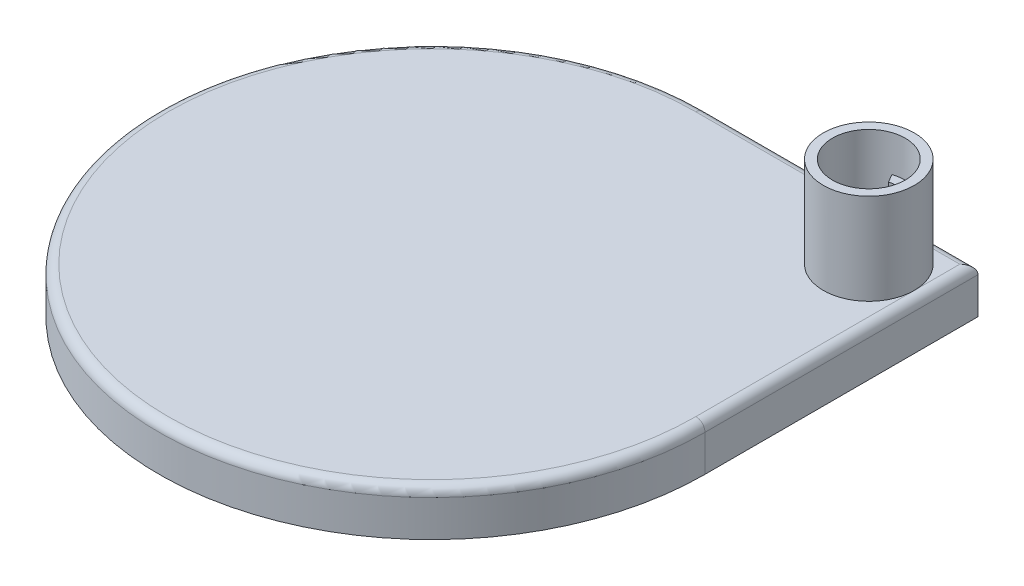
ISO-10303-21;
HEADER;
FILE_DESCRIPTION(('STEP AP214'),'2;1');
FILE_NAME('part.step','',(''),(''),'','','');
FILE_SCHEMA(('AUTOMOTIVE_DESIGN { 1 0 10303 214 1 1 1 1 }'));
ENDSEC;
DATA;
#1=APPLICATION_CONTEXT('core data for automotive mechanical design processes');
#2=APPLICATION_PROTOCOL_DEFINITION('international standard','automotive_design',2000,#1);
#3=PRODUCT_CONTEXT('',#1,'mechanical');
#4=PRODUCT('Part','Part','',(#3));
#5=PRODUCT_RELATED_PRODUCT_CATEGORY('part','',(#4));
#6=PRODUCT_DEFINITION_FORMATION('','',#4);
#7=PRODUCT_DEFINITION_CONTEXT('part definition',#1,'design');
#8=PRODUCT_DEFINITION('design','',#6,#7);
#9=PRODUCT_DEFINITION_SHAPE('','',#8);
#10=(LENGTH_UNIT() NAMED_UNIT(*) SI_UNIT(.MILLI.,.METRE.));
#11=(NAMED_UNIT(*) PLANE_ANGLE_UNIT() SI_UNIT($,.RADIAN.));
#12=(NAMED_UNIT(*) SI_UNIT($,.STERADIAN.) SOLID_ANGLE_UNIT());
#13=UNCERTAINTY_MEASURE_WITH_UNIT(LENGTH_MEASURE(1.E-05),#10,'distance_accuracy_value','');
#14=(GEOMETRIC_REPRESENTATION_CONTEXT(3) GLOBAL_UNCERTAINTY_ASSIGNED_CONTEXT((#13)) GLOBAL_UNIT_ASSIGNED_CONTEXT((#10,
#11,#12)) REPRESENTATION_CONTEXT('',''));
#15=CARTESIAN_POINT('',(0.,0.,0.));
#16=DIRECTION('',(0.,0.,1.));
#17=DIRECTION('',(1.,0.,0.));
#18=AXIS2_PLACEMENT_3D('',#15,#16,#17);
#19=CARTESIAN_POINT('',(-38.1,6.35,38.1));
#20=DIRECTION('',(0.,1.,0.));
#21=DIRECTION('',(0.,0.,1.));
#22=AXIS2_PLACEMENT_3D('',#19,#20,#21);
#23=PLANE('',#22);
#24=CARTESIAN_POINT('',(-7.62000000000001,6.35,7.62));
#25=DIRECTION('',(0.,1.,0.));
#26=DIRECTION('',(0.,0.,1.));
#27=AXIS2_PLACEMENT_3D('',#24,#25,#26);
#28=CIRCLE('',#27,6.34999999999997);
#29=CARTESIAN_POINT('',(-1.27,6.35,7.62));
#30=VERTEX_POINT('',#29);
#31=CARTESIAN_POINT('',(-7.62000000000002,6.35,1.27));
#32=VERTEX_POINT('',#31);
#33=EDGE_CURVE('E244',#30,#32,#28,.T.);
#34=ORIENTED_EDGE('',*,*,#33,.F.);
#35=DIRECTION('',(0.,0.,-1.));
#36=VECTOR('',#35,1.);
#37=CARTESIAN_POINT('',(-1.27,6.35,0.));
#38=LINE('',#37,#36);
#39=CARTESIAN_POINT('',(-1.27,6.35,1.27));
#40=VERTEX_POINT('',#39);
#41=EDGE_CURVE('E285',#30,#40,#38,.T.);
#42=ORIENTED_EDGE('',*,*,#41,.T.);
#43=DIRECTION('',(-1.,0.,0.));
#44=VECTOR('',#43,1.);
#45=CARTESIAN_POINT('',(-38.1,6.35,1.27000000000002));
#46=LINE('',#45,#44);
#47=EDGE_CURVE('E281',#40,#32,#46,.T.);
#48=ORIENTED_EDGE('',*,*,#47,.T.);
#49=EDGE_LOOP('',(#34,#42,#48));
#50=FACE_BOUND('',#49,.T.);
#51=ADVANCED_FACE('F38',(#50),#23,.T.);
#52=CARTESIAN_POINT('',(0.,6.35,0.));
#53=DIRECTION('',(-1.,0.,0.));
#54=DIRECTION('',(0.,0.,1.));
#55=AXIS2_PLACEMENT_3D('',#52,#53,#54);
#56=PLANE('',#55);
#57=DIRECTION('',(0.,-1.,0.));
#58=VECTOR('',#57,1.);
#59=CARTESIAN_POINT('',(0.,6.35,0.));
#60=LINE('',#59,#58);
#61=CARTESIAN_POINT('',(0.,5.08,0.));
#62=VERTEX_POINT('',#61);
#63=CARTESIAN_POINT('',(0.,0.,0.));
#64=VERTEX_POINT('',#63);
#65=EDGE_CURVE('E265',#62,#64,#60,.T.);
#66=ORIENTED_EDGE('',*,*,#65,.F.);
#67=DIRECTION('',(0.,0.,-1.));
#68=VECTOR('',#67,1.);
#69=CARTESIAN_POINT('',(0.,5.08,38.1));
#70=LINE('',#69,#68);
#71=CARTESIAN_POINT('',(0.,5.08,38.1));
#72=VERTEX_POINT('',#71);
#73=EDGE_CURVE('E48',#62,#72,#70,.F.);
#74=ORIENTED_EDGE('',*,*,#73,.T.);
#75=DIRECTION('',(0.,-1.,0.));
#76=VECTOR('',#75,1.);
#77=CARTESIAN_POINT('',(0.,6.35,38.1));
#78=LINE('',#77,#76);
#79=CARTESIAN_POINT('',(0.,0.,38.1));
#80=VERTEX_POINT('',#79);
#81=EDGE_CURVE('E259',#72,#80,#78,.T.);
#82=ORIENTED_EDGE('',*,*,#81,.T.);
#83=DIRECTION('',(0.,0.,-1.));
#84=VECTOR('',#83,1.);
#85=CARTESIAN_POINT('',(0.,0.,0.));
#86=LINE('',#85,#84);
#87=EDGE_CURVE('E243',#80,#64,#86,.T.);
#88=ORIENTED_EDGE('',*,*,#87,.T.);
#89=EDGE_LOOP('',(#66,#74,#82,#88));
#90=FACE_BOUND('',#89,.T.);
#91=ADVANCED_FACE('F323',(#90),#56,.F.);
#92=CARTESIAN_POINT('',(0.,6.35,0.));
#93=DIRECTION('',(0.,0.,1.));
#94=DIRECTION('',(1.,0.,0.));
#95=AXIS2_PLACEMENT_3D('',#92,#93,#94);
#96=PLANE('',#95);
#97=DIRECTION('',(0.,-1.,0.));
#98=VECTOR('',#97,1.);
#99=CARTESIAN_POINT('',(-38.1,6.35,0.));
#100=LINE('',#99,#98);
#101=CARTESIAN_POINT('',(-38.1,5.08,0.));
#102=VERTEX_POINT('',#101);
#103=CARTESIAN_POINT('',(-38.1,0.,0.));
#104=VERTEX_POINT('',#103);
#105=EDGE_CURVE('E262',#102,#104,#100,.T.);
#106=ORIENTED_EDGE('',*,*,#105,.F.);
#107=DIRECTION('',(-1.,0.,0.));
#108=VECTOR('',#107,1.);
#109=CARTESIAN_POINT('',(0.,5.08,0.));
#110=LINE('',#109,#108);
#111=EDGE_CURVE('E288',#102,#62,#110,.F.);
#112=ORIENTED_EDGE('',*,*,#111,.T.);
#113=ORIENTED_EDGE('',*,*,#65,.T.);
#114=DIRECTION('',(-1.,0.,0.));
#115=VECTOR('',#114,1.);
#116=CARTESIAN_POINT('',(0.,0.,0.));
#117=LINE('',#116,#115);
#118=EDGE_CURVE('E251',#64,#104,#117,.T.);
#119=ORIENTED_EDGE('',*,*,#118,.T.);
#120=EDGE_LOOP('',(#106,#112,#113,#119));
#121=FACE_BOUND('',#120,.T.);
#122=ADVANCED_FACE('F321',(#121),#96,.F.);
#123=CARTESIAN_POINT('',(-38.1,6.35,38.1));
#124=DIRECTION('',(0.,-1.,0.));
#125=DIRECTION('',(0.,0.,-1.));
#126=AXIS2_PLACEMENT_3D('',#123,#124,#125);
#127=CYLINDRICAL_SURFACE('',#126,38.1);
#128=ORIENTED_EDGE('',*,*,#81,.F.);
#129=CARTESIAN_POINT('',(-38.1,5.08,38.1));
#130=DIRECTION('',(0.,1.,0.));
#131=DIRECTION('',(0.,0.,1.));
#132=AXIS2_PLACEMENT_3D('',#129,#130,#131);
#133=CIRCLE('',#132,38.1);
#134=EDGE_CURVE('E11',#72,#102,#133,.F.);
#135=ORIENTED_EDGE('',*,*,#134,.T.);
#136=ORIENTED_EDGE('',*,*,#105,.T.);
#137=CARTESIAN_POINT('',(-38.1,0.,38.1));
#138=DIRECTION('',(0.,1.,0.));
#139=DIRECTION('',(0.,0.,1.));
#140=AXIS2_PLACEMENT_3D('',#137,#138,#139);
#141=CIRCLE('',#140,38.1);
#142=EDGE_CURVE('E255',#104,#80,#141,.T.);
#143=ORIENTED_EDGE('',*,*,#142,.T.);
#144=EDGE_LOOP('',(#128,#135,#136,#143));
#145=FACE_BOUND('',#144,.T.);
#146=ADVANCED_FACE('F329',(#145),#127,.T.);
#147=EDGE_CURVE('E238',#32,#30,#28,.T.);
#148=ORIENTED_EDGE('',*,*,#147,.F.);
#149=DIRECTION('',(-1.,0.,0.));
#150=VECTOR('',#149,1.);
#151=CARTESIAN_POINT('',(-38.1,6.35,1.27000000000002));
#152=LINE('',#151,#150);
#153=CARTESIAN_POINT('',(-38.1,6.35,1.27000000000002));
#154=VERTEX_POINT('',#153);
#155=EDGE_CURVE('E278',#32,#154,#152,.T.);
#156=ORIENTED_EDGE('',*,*,#155,.T.);
#157=CARTESIAN_POINT('',(-38.1,6.35,38.1));
#158=DIRECTION('',(0.,1.,0.));
#159=DIRECTION('',(0.,0.,1.));
#160=AXIS2_PLACEMENT_3D('',#157,#158,#159);
#161=CIRCLE('',#160,36.83);
#162=CARTESIAN_POINT('',(-1.27000000000001,6.35,38.1));
#163=VERTEX_POINT('',#162);
#164=EDGE_CURVE('E272',#154,#163,#161,.T.);
#165=ORIENTED_EDGE('',*,*,#164,.T.);
#166=DIRECTION('',(0.,0.,-1.));
#167=VECTOR('',#166,1.);
#168=CARTESIAN_POINT('',(-1.27,6.35,0.));
#169=LINE('',#168,#167);
#170=EDGE_CURVE('E275',#163,#30,#169,.T.);
#171=ORIENTED_EDGE('',*,*,#170,.T.);
#172=EDGE_LOOP('',(#148,#156,#165,#171));
#173=FACE_BOUND('',#172,.T.);
#174=ADVANCED_FACE('F312',(#173),#23,.T.);
#175=CARTESIAN_POINT('',(-38.1,0.,38.1));
#176=DIRECTION('',(0.,1.,0.));
#177=DIRECTION('',(0.,0.,1.));
#178=AXIS2_PLACEMENT_3D('',#175,#176,#177);
#179=PLANE('',#178);
#180=ORIENTED_EDGE('',*,*,#87,.F.);
#181=ORIENTED_EDGE('',*,*,#142,.F.);
#182=ORIENTED_EDGE('',*,*,#118,.F.);
#183=EDGE_LOOP('',(#180,#181,#182));
#184=FACE_BOUND('',#183,.T.);
#185=ADVANCED_FACE('F327',(#184),#179,.F.);
#186=CARTESIAN_POINT('',(-7.62000000000001,19.05,7.62));
#187=DIRECTION('',(0.,1.,0.));
#188=DIRECTION('',(0.,0.,1.));
#189=AXIS2_PLACEMENT_3D('',#186,#187,#188);
#190=PLANE('',#189);
#191=CARTESIAN_POINT('',(-7.62000000000001,19.05,7.62));
#192=DIRECTION('',(0.,1.,0.));
#193=DIRECTION('',(0.,0.,1.));
#194=AXIS2_PLACEMENT_3D('',#191,#192,#193);
#195=CIRCLE('',#194,6.34999999999997);
#196=CARTESIAN_POINT('',(-7.62000000000001,19.05,13.97));
#197=VERTEX_POINT('',#196);
#198=EDGE_CURVE('E239',#197,#197,#195,.T.);
#199=ORIENTED_EDGE('',*,*,#198,.T.);
#200=EDGE_LOOP('',(#199));
#201=FACE_BOUND('',#200,.T.);
#202=CARTESIAN_POINT('',(-7.62000000000001,19.05,7.62));
#203=DIRECTION('',(0.,1.,0.));
#204=DIRECTION('',(0.,0.,1.));
#205=AXIS2_PLACEMENT_3D('',#202,#203,#204);
#206=CIRCLE('',#205,5.08);
#207=CARTESIAN_POINT('',(-7.62000000000001,19.05,12.7));
#208=VERTEX_POINT('',#207);
#209=EDGE_CURVE('E234',#208,#208,#206,.T.);
#210=ORIENTED_EDGE('',*,*,#209,.F.);
#211=EDGE_LOOP('',(#210));
#212=FACE_BOUND('',#211,.T.);
#213=ADVANCED_FACE('F367',(#201,#212),#190,.T.);
#214=CARTESIAN_POINT('',(-7.62000000000001,19.05,7.62));
#215=DIRECTION('',(0.,-1.,0.));
#216=DIRECTION('',(0.,0.,-1.));
#217=AXIS2_PLACEMENT_3D('',#214,#215,#216);
#218=CYLINDRICAL_SURFACE('',#217,6.34999999999997);
#219=ORIENTED_EDGE('',*,*,#198,.F.);
#220=EDGE_LOOP('',(#219));
#221=FACE_BOUND('',#220,.T.);
#222=ORIENTED_EDGE('',*,*,#33,.T.);
#223=ORIENTED_EDGE('',*,*,#147,.T.);
#224=EDGE_LOOP('',(#222,#223));
#225=FACE_BOUND('',#224,.T.);
#226=ADVANCED_FACE('F315',(#221,#225),#218,.T.);
#227=CARTESIAN_POINT('',(-7.62000000000001,19.05,7.62));
#228=DIRECTION('',(0.,-1.,0.));
#229=DIRECTION('',(0.,0.,-1.));
#230=AXIS2_PLACEMENT_3D('',#227,#228,#229);
#231=CYLINDRICAL_SURFACE('',#230,5.08);
#232=CARTESIAN_POINT('',(-7.62000000000001,13.97,7.62));
#233=DIRECTION('',(0.,1.,0.));
#234=DIRECTION('',(0.,0.,1.));
#235=AXIS2_PLACEMENT_3D('',#232,#233,#234);
#236=CIRCLE('',#235,5.08);
#237=CARTESIAN_POINT('',(-9.2165627607767,13.97,12.4425913522608));
#238=VERTEX_POINT('',#237);
#239=CARTESIAN_POINT('',(-6.02343723922332,13.97,12.4425913522608));
#240=VERTEX_POINT('',#239);
#241=EDGE_CURVE('E160',#238,#240,#236,.T.);
#242=ORIENTED_EDGE('',*,*,#241,.F.);
#243=DIRECTION('',(0.,-1.,0.));
#244=VECTOR('',#243,1.);
#245=CARTESIAN_POINT('',(-9.2165627607767,13.97,12.4425913522608));
#246=LINE('',#245,#244);
#247=CARTESIAN_POINT('',(-9.2165627607767,11.43,12.4425913522608));
#248=VERTEX_POINT('',#247);
#249=EDGE_CURVE('E151',#238,#248,#246,.T.);
#250=ORIENTED_EDGE('',*,*,#249,.T.);
#251=CARTESIAN_POINT('',(-7.62000000000001,11.43,7.62));
#252=DIRECTION('',(0.,1.,0.));
#253=DIRECTION('',(0.,0.,1.));
#254=AXIS2_PLACEMENT_3D('',#251,#252,#253);
#255=CIRCLE('',#254,5.08);
#256=CARTESIAN_POINT('',(-6.02343723922332,11.43,12.4425913522608));
#257=VERTEX_POINT('',#256);
#258=EDGE_CURVE('E169',#248,#257,#255,.T.);
#259=ORIENTED_EDGE('',*,*,#258,.T.);
#260=DIRECTION('',(0.,-1.,0.));
#261=VECTOR('',#260,1.);
#262=CARTESIAN_POINT('',(-6.02343723922332,13.97,12.4425913522608));
#263=LINE('',#262,#261);
#264=EDGE_CURVE('E187',#240,#257,#263,.T.);
#265=ORIENTED_EDGE('',*,*,#264,.F.);
#266=EDGE_LOOP('',(#242,#250,#259,#265));
#267=FACE_BOUND('',#266,.T.);
#268=CARTESIAN_POINT('',(-7.62000000000001,13.97,7.62));
#269=DIRECTION('',(0.,1.,0.));
#270=DIRECTION('',(0.,0.,1.));
#271=AXIS2_PLACEMENT_3D('',#268,#269,#270);
#272=CIRCLE('',#271,5.08);
#273=CARTESIAN_POINT('',(-6.02343723922332,13.97,2.79740864773915));
#274=VERTEX_POINT('',#273);
#275=CARTESIAN_POINT('',(-9.2165627607767,13.97,2.79740864773915));
#276=VERTEX_POINT('',#275);
#277=EDGE_CURVE('E201',#274,#276,#272,.T.);
#278=ORIENTED_EDGE('',*,*,#277,.F.);
#279=DIRECTION('',(0.,-1.,0.));
#280=VECTOR('',#279,1.);
#281=CARTESIAN_POINT('',(-6.02343723922332,13.97,2.79740864773915));
#282=LINE('',#281,#280);
#283=CARTESIAN_POINT('',(-6.02343723922332,11.43,2.79740864773915));
#284=VERTEX_POINT('',#283);
#285=EDGE_CURVE('E227',#274,#284,#282,.T.);
#286=ORIENTED_EDGE('',*,*,#285,.T.);
#287=CARTESIAN_POINT('',(-7.62000000000001,11.43,7.62));
#288=DIRECTION('',(0.,1.,0.));
#289=DIRECTION('',(0.,0.,1.));
#290=AXIS2_PLACEMENT_3D('',#287,#288,#289);
#291=CIRCLE('',#290,5.08);
#292=CARTESIAN_POINT('',(-9.2165627607767,11.43,2.79740864773915));
#293=VERTEX_POINT('',#292);
#294=EDGE_CURVE('E215',#284,#293,#291,.T.);
#295=ORIENTED_EDGE('',*,*,#294,.T.);
#296=DIRECTION('',(0.,-1.,0.));
#297=VECTOR('',#296,1.);
#298=CARTESIAN_POINT('',(-9.2165627607767,13.97,2.79740864773915));
#299=LINE('',#298,#297);
#300=EDGE_CURVE('E223',#276,#293,#299,.T.);
#301=ORIENTED_EDGE('',*,*,#300,.F.);
#302=EDGE_LOOP('',(#278,#286,#295,#301));
#303=FACE_BOUND('',#302,.T.);
#304=ORIENTED_EDGE('',*,*,#209,.T.);
#305=EDGE_LOOP('',(#304));
#306=FACE_BOUND('',#305,.T.);
#307=CARTESIAN_POINT('',(-7.62000000000001,6.35,7.62));
#308=DIRECTION('',(0.,1.,0.));
#309=DIRECTION('',(0.,0.,1.));
#310=AXIS2_PLACEMENT_3D('',#307,#308,#309);
#311=CIRCLE('',#310,5.08);
#312=CARTESIAN_POINT('',(-7.62000000000001,6.35,12.7));
#313=VERTEX_POINT('',#312);
#314=EDGE_CURVE('E268',#313,#313,#311,.F.);
#315=ORIENTED_EDGE('',*,*,#314,.T.);
#316=EDGE_LOOP('',(#315));
#317=FACE_BOUND('',#316,.T.);
#318=ADVANCED_FACE('F349',(#267,#303,#306,#317),#231,.F.);
#319=ORIENTED_EDGE('',*,*,#314,.F.);
#320=EDGE_LOOP('',(#319));
#321=FACE_BOUND('',#320,.T.);
#322=ADVANCED_FACE('F337',(#321),#23,.T.);
#323=CARTESIAN_POINT('',(-7.62000000000001,13.97,7.62));
#324=DIRECTION('',(0.,-1.,0.));
#325=DIRECTION('',(0.,0.,-1.));
#326=AXIS2_PLACEMENT_3D('',#323,#324,#325);
#327=CYLINDRICAL_SURFACE('',#326,3.81);
#328=CARTESIAN_POINT('',(-7.62000000000001,11.43,7.62));
#329=DIRECTION('',(0.,1.,0.));
#330=DIRECTION('',(0.,0.,1.));
#331=AXIS2_PLACEMENT_3D('',#328,#329,#330);
#332=CIRCLE('',#331,3.81);
#333=CARTESIAN_POINT('',(-6.67656276077671,11.43,3.92865523478953));
#334=VERTEX_POINT('',#333);
#335=CARTESIAN_POINT('',(-8.56343723922333,11.43,3.92865523478953));
#336=VERTEX_POINT('',#335);
#337=EDGE_CURVE('E150',#334,#336,#332,.T.);
#338=ORIENTED_EDGE('',*,*,#337,.F.);
#339=DIRECTION('',(0.,-1.,0.));
#340=VECTOR('',#339,1.);
#341=CARTESIAN_POINT('',(-6.67656276077671,13.97,3.92865523478953));
#342=LINE('',#341,#340);
#343=CARTESIAN_POINT('',(-6.67656276077671,13.97,3.92865523478953));
#344=VERTEX_POINT('',#343);
#345=EDGE_CURVE('E231',#344,#334,#342,.T.);
#346=ORIENTED_EDGE('',*,*,#345,.F.);
#347=CARTESIAN_POINT('',(-7.62000000000001,13.97,7.62));
#348=DIRECTION('',(0.,1.,0.));
#349=DIRECTION('',(0.,0.,1.));
#350=AXIS2_PLACEMENT_3D('',#347,#348,#349);
#351=CIRCLE('',#350,3.81);
#352=CARTESIAN_POINT('',(-8.56343723922333,13.97,3.92865523478953));
#353=VERTEX_POINT('',#352);
#354=EDGE_CURVE('E193',#344,#353,#351,.T.);
#355=ORIENTED_EDGE('',*,*,#354,.T.);
#356=DIRECTION('',(0.,-1.,0.));
#357=VECTOR('',#356,1.);
#358=CARTESIAN_POINT('',(-8.56343723922333,13.97,3.92865523478953));
#359=LINE('',#358,#357);
#360=EDGE_CURVE('E208',#353,#336,#359,.T.);
#361=ORIENTED_EDGE('',*,*,#360,.T.);
#362=EDGE_LOOP('',(#338,#346,#355,#361));
#363=FACE_BOUND('',#362,.T.);
#364=ADVANCED_FACE('F348',(#363),#327,.F.);
#365=CARTESIAN_POINT('',(-3.30626445256328,13.97,-1.90887267169951));
#366=DIRECTION('',(-0.866025403784437,0.,-0.500000000000002));
#367=DIRECTION('',(-0.500000000000002,0.,0.866025403784437));
#368=AXIS2_PLACEMENT_3D('',#365,#366,#367);
#369=PLANE('',#368);
#370=DIRECTION('',(0.500000000000002,0.,-0.866025403784437));
#371=VECTOR('',#370,1.);
#372=CARTESIAN_POINT('',(-3.30626445256328,11.43,-1.90887267169951));
#373=LINE('',#372,#371);
#374=EDGE_CURVE('E212',#334,#284,#373,.T.);
#375=ORIENTED_EDGE('',*,*,#374,.T.);
#376=ORIENTED_EDGE('',*,*,#285,.F.);
#377=DIRECTION('',(0.500000000000002,0.,-0.866025403784437));
#378=VECTOR('',#377,1.);
#379=CARTESIAN_POINT('',(-3.30626445256328,13.97,-1.90887267169951));
#380=LINE('',#379,#378);
#381=EDGE_CURVE('E197',#344,#274,#380,.T.);
#382=ORIENTED_EDGE('',*,*,#381,.F.);
#383=ORIENTED_EDGE('',*,*,#345,.T.);
#384=EDGE_LOOP('',(#375,#376,#382,#383));
#385=FACE_BOUND('',#384,.T.);
#386=ADVANCED_FACE('F356',(#385),#369,.F.);
#387=CARTESIAN_POINT('',(-8.12373554743674,13.97,4.69024090513789));
#388=DIRECTION('',(-0.866025403784441,0.,0.499999999999997));
#389=DIRECTION('',(0.499999999999997,0.,0.866025403784441));
#390=AXIS2_PLACEMENT_3D('',#387,#388,#389);
#391=PLANE('',#390);
#392=DIRECTION('',(-0.499999999999997,0.,-0.866025403784441));
#393=VECTOR('',#392,1.);
#394=CARTESIAN_POINT('',(-8.12373554743674,11.43,4.69024090513789));
#395=LINE('',#394,#393);
#396=EDGE_CURVE('E198',#336,#293,#395,.T.);
#397=ORIENTED_EDGE('',*,*,#396,.F.);
#398=ORIENTED_EDGE('',*,*,#360,.F.);
#399=DIRECTION('',(-0.499999999999997,0.,-0.866025403784441));
#400=VECTOR('',#399,1.);
#401=CARTESIAN_POINT('',(-8.12373554743674,13.97,4.69024090513789));
#402=LINE('',#401,#400);
#403=EDGE_CURVE('E204',#353,#276,#402,.T.);
#404=ORIENTED_EDGE('',*,*,#403,.T.);
#405=ORIENTED_EDGE('',*,*,#300,.T.);
#406=EDGE_LOOP('',(#397,#398,#404,#405));
#407=FACE_BOUND('',#406,.T.);
#408=ADVANCED_FACE('F416',(#407),#391,.T.);
#409=CARTESIAN_POINT('',(0.,13.97,0.));
#410=DIRECTION('',(0.,1.,0.));
#411=DIRECTION('',(0.,0.,1.));
#412=AXIS2_PLACEMENT_3D('',#409,#410,#411);
#413=PLANE('',#412);
#414=ORIENTED_EDGE('',*,*,#354,.F.);
#415=ORIENTED_EDGE('',*,*,#381,.T.);
#416=ORIENTED_EDGE('',*,*,#277,.T.);
#417=ORIENTED_EDGE('',*,*,#403,.F.);
#418=EDGE_LOOP('',(#414,#415,#416,#417));
#419=FACE_BOUND('',#418,.T.);
#420=ADVANCED_FACE('F424',(#419),#413,.T.);
#421=CARTESIAN_POINT('',(0.,11.43,0.));
#422=DIRECTION('',(0.,1.,0.));
#423=DIRECTION('',(0.,0.,1.));
#424=AXIS2_PLACEMENT_3D('',#421,#422,#423);
#425=PLANE('',#424);
#426=ORIENTED_EDGE('',*,*,#337,.T.);
#427=ORIENTED_EDGE('',*,*,#396,.T.);
#428=ORIENTED_EDGE('',*,*,#294,.F.);
#429=ORIENTED_EDGE('',*,*,#374,.F.);
#430=EDGE_LOOP('',(#426,#427,#428,#429));
#431=FACE_BOUND('',#430,.T.);
#432=ADVANCED_FACE('F433',(#431),#425,.F.);
#433=CARTESIAN_POINT('',(-7.62000000000001,13.97,7.62));
#434=DIRECTION('',(0.,-1.,0.));
#435=DIRECTION('',(0.,0.,-1.));
#436=AXIS2_PLACEMENT_3D('',#433,#434,#435);
#437=CYLINDRICAL_SURFACE('',#436,3.81);
#438=CARTESIAN_POINT('',(-7.62000000000001,11.43,7.62));
#439=DIRECTION('',(0.,1.,0.));
#440=DIRECTION('',(0.,0.,1.));
#441=AXIS2_PLACEMENT_3D('',#438,#439,#440);
#442=CIRCLE('',#441,3.81);
#443=CARTESIAN_POINT('',(-8.56343723922332,11.43,11.3113447652105));
#444=VERTEX_POINT('',#443);
#445=CARTESIAN_POINT('',(-6.67656276077671,11.43,11.3113447652105));
#446=VERTEX_POINT('',#445);
#447=EDGE_CURVE('E146',#444,#446,#442,.T.);
#448=ORIENTED_EDGE('',*,*,#447,.F.);
#449=DIRECTION('',(0.,-1.,0.));
#450=VECTOR('',#449,1.);
#451=CARTESIAN_POINT('',(-8.56343723922332,13.97,11.3113447652105));
#452=LINE('',#451,#450);
#453=CARTESIAN_POINT('',(-8.56343723922332,13.97,11.3113447652105));
#454=VERTEX_POINT('',#453);
#455=EDGE_CURVE('E139',#454,#444,#452,.T.);
#456=ORIENTED_EDGE('',*,*,#455,.F.);
#457=CARTESIAN_POINT('',(-7.62000000000001,13.97,7.62));
#458=DIRECTION('',(0.,1.,0.));
#459=DIRECTION('',(0.,0.,1.));
#460=AXIS2_PLACEMENT_3D('',#457,#458,#459);
#461=CIRCLE('',#460,3.81);
#462=CARTESIAN_POINT('',(-6.67656276077671,13.97,11.3113447652105));
#463=VERTEX_POINT('',#462);
#464=EDGE_CURVE('E143',#454,#463,#461,.T.);
#465=ORIENTED_EDGE('',*,*,#464,.T.);
#466=DIRECTION('',(0.,-1.,0.));
#467=VECTOR('',#466,1.);
#468=CARTESIAN_POINT('',(-6.67656276077671,13.97,11.3113447652105));
#469=LINE('',#468,#467);
#470=EDGE_CURVE('E176',#463,#446,#469,.T.);
#471=ORIENTED_EDGE('',*,*,#470,.T.);
#472=EDGE_LOOP('',(#448,#456,#465,#471));
#473=FACE_BOUND('',#472,.T.);
#474=ADVANCED_FACE('F141',(#473),#437,.F.);
#475=CARTESIAN_POINT('',(-1.52462197059936,13.97,-0.880240905137947));
#476=DIRECTION('',(0.866025403784441,0.,0.499999999999996));
#477=DIRECTION('',(0.499999999999996,0.,-0.866025403784441));
#478=AXIS2_PLACEMENT_3D('',#475,#476,#477);
#479=PLANE('',#478);
#480=DIRECTION('',(-0.499999999999996,0.,0.866025403784441));
#481=VECTOR('',#480,1.);
#482=CARTESIAN_POINT('',(-1.52462197059936,11.43,-0.880240905137947));
#483=LINE('',#482,#481);
#484=EDGE_CURVE('E179',#444,#248,#483,.T.);
#485=ORIENTED_EDGE('',*,*,#484,.T.);
#486=ORIENTED_EDGE('',*,*,#249,.F.);
#487=DIRECTION('',(-0.499999999999996,0.,0.866025403784441));
#488=VECTOR('',#487,1.);
#489=CARTESIAN_POINT('',(-1.52462197059936,13.97,-0.880240905137947));
#490=LINE('',#489,#488);
#491=EDGE_CURVE('E154',#454,#238,#490,.T.);
#492=ORIENTED_EDGE('',*,*,#491,.F.);
#493=ORIENTED_EDGE('',*,*,#455,.T.);
#494=EDGE_LOOP('',(#485,#486,#492,#493));
#495=FACE_BOUND('',#494,.T.);
#496=ADVANCED_FACE('F155',(#495),#479,.F.);
#497=CARTESIAN_POINT('',(-9.90537802940072,13.97,5.71887267169954));
#498=DIRECTION('',(0.866025403784438,0.,-0.500000000000002));
#499=DIRECTION('',(-0.500000000000002,0.,-0.866025403784438));
#500=AXIS2_PLACEMENT_3D('',#497,#498,#499);
#501=PLANE('',#500);
#502=DIRECTION('',(0.500000000000002,0.,0.866025403784438));
#503=VECTOR('',#502,1.);
#504=CARTESIAN_POINT('',(-9.90537802940072,11.43,5.71887267169954));
#505=LINE('',#504,#503);
#506=EDGE_CURVE('E166',#446,#257,#505,.T.);
#507=ORIENTED_EDGE('',*,*,#506,.F.);
#508=ORIENTED_EDGE('',*,*,#470,.F.);
#509=DIRECTION('',(0.500000000000002,0.,0.866025403784438));
#510=VECTOR('',#509,1.);
#511=CARTESIAN_POINT('',(-9.90537802940072,13.97,5.71887267169954));
#512=LINE('',#511,#510);
#513=EDGE_CURVE('E164',#463,#240,#512,.T.);
#514=ORIENTED_EDGE('',*,*,#513,.T.);
#515=ORIENTED_EDGE('',*,*,#264,.T.);
#516=EDGE_LOOP('',(#507,#508,#514,#515));
#517=FACE_BOUND('',#516,.T.);
#518=ADVANCED_FACE('F457',(#517),#501,.T.);
#519=CARTESIAN_POINT('',(0.,13.97,0.));
#520=DIRECTION('',(0.,1.,0.));
#521=DIRECTION('',(0.,0.,1.));
#522=AXIS2_PLACEMENT_3D('',#519,#520,#521);
#523=PLANE('',#522);
#524=ORIENTED_EDGE('',*,*,#464,.F.);
#525=ORIENTED_EDGE('',*,*,#491,.T.);
#526=ORIENTED_EDGE('',*,*,#241,.T.);
#527=ORIENTED_EDGE('',*,*,#513,.F.);
#528=EDGE_LOOP('',(#524,#525,#526,#527));
#529=FACE_BOUND('',#528,.T.);
#530=ADVANCED_FACE('F162',(#529),#523,.T.);
#531=CARTESIAN_POINT('',(0.,11.43,0.));
#532=DIRECTION('',(0.,1.,0.));
#533=DIRECTION('',(0.,0.,1.));
#534=AXIS2_PLACEMENT_3D('',#531,#532,#533);
#535=PLANE('',#534);
#536=ORIENTED_EDGE('',*,*,#447,.T.);
#537=ORIENTED_EDGE('',*,*,#506,.T.);
#538=ORIENTED_EDGE('',*,*,#258,.F.);
#539=ORIENTED_EDGE('',*,*,#484,.F.);
#540=EDGE_LOOP('',(#536,#537,#538,#539));
#541=FACE_BOUND('',#540,.T.);
#542=ADVANCED_FACE('F473',(#541),#535,.F.);
#543=CARTESIAN_POINT('',(-1.27000000000001,5.08,38.1));
#544=DIRECTION('',(0.,0.,1.));
#545=DIRECTION('',(1.,0.,0.));
#546=AXIS2_PLACEMENT_3D('',#543,#544,#545);
#547=CYLINDRICAL_SURFACE('',#546,1.27);
#548=ORIENTED_EDGE('',*,*,#41,.F.);
#549=ORIENTED_EDGE('',*,*,#170,.F.);
#550=CARTESIAN_POINT('',(-1.27000000000001,5.08,38.1));
#551=DIRECTION('',(0.,0.,1.));
#552=DIRECTION('',(1.,0.,0.));
#553=AXIS2_PLACEMENT_3D('',#550,#551,#552);
#554=CIRCLE('',#553,1.27);
#555=EDGE_CURVE('E42',#72,#163,#554,.T.);
#556=ORIENTED_EDGE('',*,*,#555,.F.);
#557=ORIENTED_EDGE('',*,*,#73,.F.);
#558=CARTESIAN_POINT('',(-1.27,5.08,1.27));
#559=DIRECTION('',(0.707106781186548,0.,0.707106781186547));
#560=DIRECTION('',(-0.707106781186547,0.,0.707106781186548));
#561=AXIS2_PLACEMENT_3D('',#558,#559,#560);
#562=ELLIPSE('',#561,1.79605122421383,1.27);
#563=EDGE_CURVE('E63',#40,#62,#562,.F.);
#564=ORIENTED_EDGE('',*,*,#563,.F.);
#565=EDGE_LOOP('',(#548,#549,#556,#557,#564));
#566=FACE_BOUND('',#565,.T.);
#567=ADVANCED_FACE('F40',(#566),#547,.T.);
#568=CARTESIAN_POINT('',(-38.1,5.08,38.1));
#569=DIRECTION('',(0.,1.,0.));
#570=DIRECTION('',(0.,0.,1.));
#571=AXIS2_PLACEMENT_3D('',#568,#569,#570);
#572=TOROIDAL_SURFACE('',#571,36.83,1.27);
#573=ORIENTED_EDGE('',*,*,#555,.T.);
#574=ORIENTED_EDGE('',*,*,#164,.F.);
#575=CARTESIAN_POINT('',(-38.1,5.08,1.27000000000002));
#576=DIRECTION('',(1.,0.,0.));
#577=DIRECTION('',(0.,0.,-1.));
#578=AXIS2_PLACEMENT_3D('',#575,#576,#577);
#579=CIRCLE('',#578,1.27);
#580=EDGE_CURVE('E294',#102,#154,#579,.T.);
#581=ORIENTED_EDGE('',*,*,#580,.F.);
#582=ORIENTED_EDGE('',*,*,#134,.F.);
#583=EDGE_LOOP('',(#573,#574,#581,#582));
#584=FACE_BOUND('',#583,.T.);
#585=ADVANCED_FACE('F304',(#584),#572,.T.);
#586=CARTESIAN_POINT('',(-38.1,5.08,1.27000000000002));
#587=DIRECTION('',(1.,0.,0.));
#588=DIRECTION('',(0.,0.,-1.));
#589=AXIS2_PLACEMENT_3D('',#586,#587,#588);
#590=CYLINDRICAL_SURFACE('',#589,1.27);
#591=ORIENTED_EDGE('',*,*,#563,.T.);
#592=ORIENTED_EDGE('',*,*,#111,.F.);
#593=ORIENTED_EDGE('',*,*,#580,.T.);
#594=ORIENTED_EDGE('',*,*,#155,.F.);
#595=ORIENTED_EDGE('',*,*,#47,.F.);
#596=EDGE_LOOP('',(#591,#592,#593,#594,#595));
#597=FACE_BOUND('',#596,.T.);
#598=ADVANCED_FACE('F318',(#597),#590,.T.);
#599=CLOSED_SHELL('',(#51,#91,#122,#146,#174,#185,#213,#226,#318,#322,#364,#386,#408,#420,#432,
#474,#496,#518,#530,#542,#567,#585,#598));
#600=MANIFOLD_SOLID_BREP('B2',#599);
#601=ADVANCED_BREP_SHAPE_REPRESENTATION('',(#18,#600),#14);
#602=SHAPE_DEFINITION_REPRESENTATION(#9,#601);
ENDSEC;
END-ISO-10303-21;
